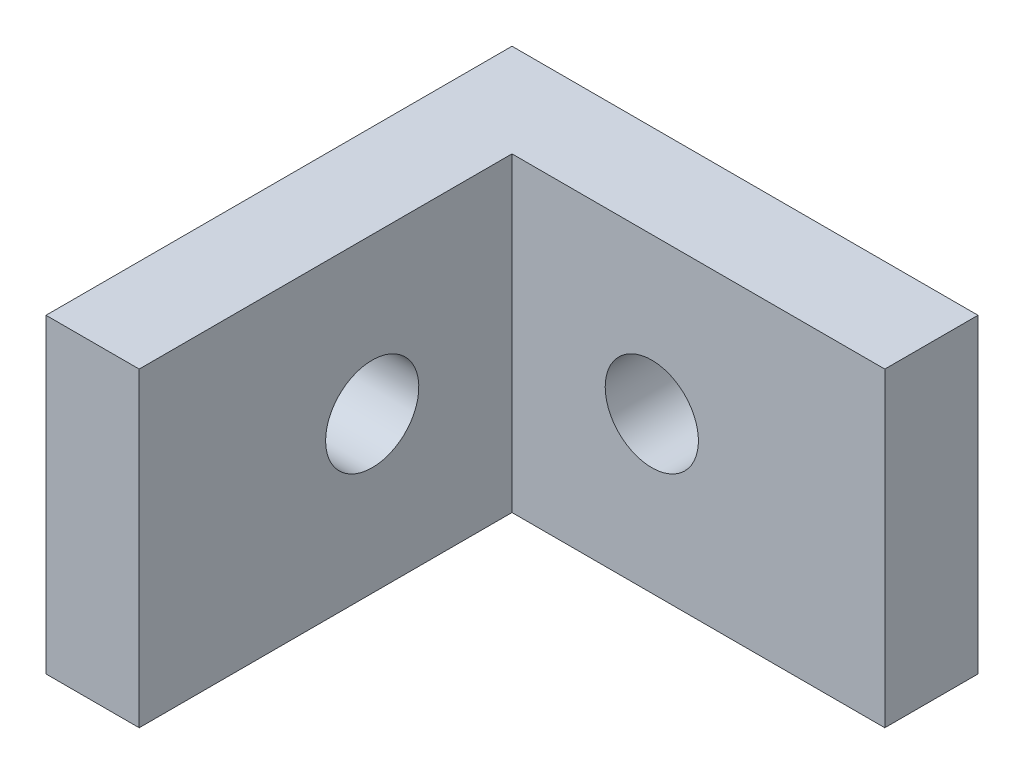
ISO-10303-21;
HEADER;
FILE_DESCRIPTION(('STEP AP214'),'2;1');
FILE_NAME('part.step','',(''),(''),'','','');
FILE_SCHEMA(('AUTOMOTIVE_DESIGN { 1 0 10303 214 1 1 1 1 }'));
ENDSEC;
DATA;
#1=APPLICATION_CONTEXT('core data for automotive mechanical design processes');
#2=APPLICATION_PROTOCOL_DEFINITION('international standard','automotive_design',2000,#1);
#3=PRODUCT_CONTEXT('',#1,'mechanical');
#4=PRODUCT('Part','Part','',(#3));
#5=PRODUCT_RELATED_PRODUCT_CATEGORY('part','',(#4));
#6=PRODUCT_DEFINITION_FORMATION('','',#4);
#7=PRODUCT_DEFINITION_CONTEXT('part definition',#1,'design');
#8=PRODUCT_DEFINITION('design','',#6,#7);
#9=PRODUCT_DEFINITION_SHAPE('','',#8);
#10=(LENGTH_UNIT() NAMED_UNIT(*) SI_UNIT(.MILLI.,.METRE.));
#11=(NAMED_UNIT(*) PLANE_ANGLE_UNIT() SI_UNIT($,.RADIAN.));
#12=(NAMED_UNIT(*) SI_UNIT($,.STERADIAN.) SOLID_ANGLE_UNIT());
#13=UNCERTAINTY_MEASURE_WITH_UNIT(LENGTH_MEASURE(1.E-05),#10,'distance_accuracy_value','');
#14=(GEOMETRIC_REPRESENTATION_CONTEXT(3) GLOBAL_UNCERTAINTY_ASSIGNED_CONTEXT((#13)) GLOBAL_UNIT_ASSIGNED_CONTEXT((#10,
#11,#12)) REPRESENTATION_CONTEXT('',''));
#15=CARTESIAN_POINT('',(0.,0.,0.));
#16=DIRECTION('',(0.,0.,1.));
#17=DIRECTION('',(1.,0.,0.));
#18=AXIS2_PLACEMENT_3D('',#15,#16,#17);
#19=CARTESIAN_POINT('',(0.,0.,3.));
#20=DIRECTION('',(0.,0.,-1.));
#21=DIRECTION('',(-1.,0.,0.));
#22=AXIS2_PLACEMENT_3D('',#19,#20,#21);
#23=PLANE('',#22);
#24=CARTESIAN_POINT('',(0.,0.,3.));
#25=DIRECTION('',(0.,0.,-1.));
#26=DIRECTION('',(-1.,0.,0.));
#27=AXIS2_PLACEMENT_3D('',#24,#25,#26);
#28=CIRCLE('',#27,1.5);
#29=CARTESIAN_POINT('',(-1.5,0.,3.));
#30=VERTEX_POINT('',#29);
#31=EDGE_CURVE('E143',#30,#30,#28,.T.);
#32=ORIENTED_EDGE('',*,*,#31,.T.);
#33=EDGE_LOOP('',(#32));
#34=FACE_BOUND('',#33,.T.);
#35=DIRECTION('',(0.,1.,0.));
#36=VECTOR('',#35,1.);
#37=CARTESIAN_POINT('',(-4.5,5.,3.));
#38=LINE('',#37,#36);
#39=CARTESIAN_POINT('',(-4.5,-5.,3.));
#40=VERTEX_POINT('',#39);
#41=CARTESIAN_POINT('',(-4.5,5.,3.));
#42=VERTEX_POINT('',#41);
#43=EDGE_CURVE('E57',#40,#42,#38,.T.);
#44=ORIENTED_EDGE('',*,*,#43,.F.);
#45=DIRECTION('',(1.,0.,0.));
#46=VECTOR('',#45,1.);
#47=CARTESIAN_POINT('',(-7.5,-5.,3.));
#48=LINE('',#47,#46);
#49=CARTESIAN_POINT('',(7.5,-5.,3.));
#50=VERTEX_POINT('',#49);
#51=EDGE_CURVE('E62',#40,#50,#48,.T.);
#52=ORIENTED_EDGE('',*,*,#51,.T.);
#53=DIRECTION('',(0.,1.,0.));
#54=VECTOR('',#53,1.);
#55=CARTESIAN_POINT('',(7.5,-5.,3.));
#56=LINE('',#55,#54);
#57=CARTESIAN_POINT('',(7.5,5.,3.));
#58=VERTEX_POINT('',#57);
#59=EDGE_CURVE('E93',#50,#58,#56,.T.);
#60=ORIENTED_EDGE('',*,*,#59,.T.);
#61=DIRECTION('',(-1.,0.,0.));
#62=VECTOR('',#61,1.);
#63=CARTESIAN_POINT('',(-7.5,5.,3.));
#64=LINE('',#63,#62);
#65=EDGE_CURVE('E145',#58,#42,#64,.T.);
#66=ORIENTED_EDGE('',*,*,#65,.T.);
#67=EDGE_LOOP('',(#44,#52,#60,#66));
#68=FACE_BOUND('',#67,.T.);
#69=ADVANCED_FACE('F41',(#34,#68),#23,.F.);
#70=CARTESIAN_POINT('',(7.5,-5.,3.));
#71=DIRECTION('',(-1.,0.,0.));
#72=DIRECTION('',(0.,-1.,0.));
#73=AXIS2_PLACEMENT_3D('',#70,#71,#72);
#74=PLANE('',#73);
#75=DIRECTION('',(0.,1.,0.));
#76=VECTOR('',#75,1.);
#77=CARTESIAN_POINT('',(7.5,-5.,0.));
#78=LINE('',#77,#76);
#79=CARTESIAN_POINT('',(7.5,-5.,0.));
#80=VERTEX_POINT('',#79);
#81=CARTESIAN_POINT('',(7.5,5.,0.));
#82=VERTEX_POINT('',#81);
#83=EDGE_CURVE('E99',#80,#82,#78,.T.);
#84=ORIENTED_EDGE('',*,*,#83,.T.);
#85=DIRECTION('',(0.,0.,-1.));
#86=VECTOR('',#85,1.);
#87=CARTESIAN_POINT('',(7.5,5.,3.));
#88=LINE('',#87,#86);
#89=EDGE_CURVE('E11',#58,#82,#88,.T.);
#90=ORIENTED_EDGE('',*,*,#89,.F.);
#91=ORIENTED_EDGE('',*,*,#59,.F.);
#92=DIRECTION('',(0.,0.,-1.));
#93=VECTOR('',#92,1.);
#94=CARTESIAN_POINT('',(7.5,-5.,3.));
#95=LINE('',#94,#93);
#96=EDGE_CURVE('E85',#50,#80,#95,.T.);
#97=ORIENTED_EDGE('',*,*,#96,.T.);
#98=EDGE_LOOP('',(#84,#90,#91,#97));
#99=FACE_BOUND('',#98,.T.);
#100=ADVANCED_FACE('F43',(#99),#74,.F.);
#101=CARTESIAN_POINT('',(-7.5,5.,3.));
#102=DIRECTION('',(0.,-1.,0.));
#103=DIRECTION('',(0.,0.,-1.));
#104=AXIS2_PLACEMENT_3D('',#101,#102,#103);
#105=PLANE('',#104);
#106=DIRECTION('',(-1.,0.,0.));
#107=VECTOR('',#106,1.);
#108=CARTESIAN_POINT('',(-7.5,5.,0.));
#109=LINE('',#108,#107);
#110=CARTESIAN_POINT('',(-7.5,5.,0.));
#111=VERTEX_POINT('',#110);
#112=EDGE_CURVE('E102',#82,#111,#109,.T.);
#113=ORIENTED_EDGE('',*,*,#112,.T.);
#114=DIRECTION('',(0.,0.,-1.));
#115=VECTOR('',#114,1.);
#116=CARTESIAN_POINT('',(-7.5,5.,3.));
#117=LINE('',#116,#115);
#118=CARTESIAN_POINT('',(-7.5,5.,15.));
#119=VERTEX_POINT('',#118);
#120=EDGE_CURVE('E50',#119,#111,#117,.T.);
#121=ORIENTED_EDGE('',*,*,#120,.F.);
#122=DIRECTION('',(-1.,0.,0.));
#123=VECTOR('',#122,1.);
#124=CARTESIAN_POINT('',(-7.5,5.,15.));
#125=LINE('',#124,#123);
#126=CARTESIAN_POINT('',(-4.5,5.,15.));
#127=VERTEX_POINT('',#126);
#128=EDGE_CURVE('E127',#127,#119,#125,.T.);
#129=ORIENTED_EDGE('',*,*,#128,.F.);
#130=DIRECTION('',(0.,0.,-1.));
#131=VECTOR('',#130,1.);
#132=CARTESIAN_POINT('',(-4.5,5.,15.));
#133=LINE('',#132,#131);
#134=EDGE_CURVE('E107',#127,#42,#133,.T.);
#135=ORIENTED_EDGE('',*,*,#134,.T.);
#136=ORIENTED_EDGE('',*,*,#65,.F.);
#137=ORIENTED_EDGE('',*,*,#89,.T.);
#138=EDGE_LOOP('',(#113,#121,#129,#135,#136,#137));
#139=FACE_BOUND('',#138,.T.);
#140=ADVANCED_FACE('F124',(#139),#105,.F.);
#141=CARTESIAN_POINT('',(-7.5,-5.,3.));
#142=DIRECTION('',(1.,0.,0.));
#143=DIRECTION('',(0.,1.,0.));
#144=AXIS2_PLACEMENT_3D('',#141,#142,#143);
#145=PLANE('',#144);
#146=CARTESIAN_POINT('',(-7.5,0.,7.5));
#147=DIRECTION('',(-1.,0.,0.));
#148=DIRECTION('',(0.,0.,1.));
#149=AXIS2_PLACEMENT_3D('',#146,#147,#148);
#150=CIRCLE('',#149,1.5);
#151=CARTESIAN_POINT('',(-7.5,0.,9.));
#152=VERTEX_POINT('',#151);
#153=EDGE_CURVE('E161',#152,#152,#150,.T.);
#154=ORIENTED_EDGE('',*,*,#153,.F.);
#155=EDGE_LOOP('',(#154));
#156=FACE_BOUND('',#155,.T.);
#157=DIRECTION('',(0.,-1.,0.));
#158=VECTOR('',#157,1.);
#159=CARTESIAN_POINT('',(-7.5,-5.,0.));
#160=LINE('',#159,#158);
#161=CARTESIAN_POINT('',(-7.5,-5.,0.));
#162=VERTEX_POINT('',#161);
#163=EDGE_CURVE('E94',#111,#162,#160,.T.);
#164=ORIENTED_EDGE('',*,*,#163,.T.);
#165=DIRECTION('',(0.,0.,-1.));
#166=VECTOR('',#165,1.);
#167=CARTESIAN_POINT('',(-7.5,-5.,3.));
#168=LINE('',#167,#166);
#169=CARTESIAN_POINT('',(-7.5,-5.,15.));
#170=VERTEX_POINT('',#169);
#171=EDGE_CURVE('E89',#170,#162,#168,.T.);
#172=ORIENTED_EDGE('',*,*,#171,.F.);
#173=DIRECTION('',(0.,-1.,0.));
#174=VECTOR('',#173,1.);
#175=CARTESIAN_POINT('',(-7.5,5.,15.));
#176=LINE('',#175,#174);
#177=EDGE_CURVE('E120',#119,#170,#176,.T.);
#178=ORIENTED_EDGE('',*,*,#177,.F.);
#179=ORIENTED_EDGE('',*,*,#120,.T.);
#180=EDGE_LOOP('',(#164,#172,#178,#179));
#181=FACE_BOUND('',#180,.T.);
#182=ADVANCED_FACE('F118',(#156,#181),#145,.F.);
#183=CARTESIAN_POINT('',(-7.5,-5.,3.));
#184=DIRECTION('',(0.,1.,0.));
#185=DIRECTION('',(0.,0.,1.));
#186=AXIS2_PLACEMENT_3D('',#183,#184,#185);
#187=PLANE('',#186);
#188=DIRECTION('',(1.,0.,0.));
#189=VECTOR('',#188,1.);
#190=CARTESIAN_POINT('',(-7.5,-5.,0.));
#191=LINE('',#190,#189);
#192=EDGE_CURVE('E82',#162,#80,#191,.T.);
#193=ORIENTED_EDGE('',*,*,#192,.T.);
#194=ORIENTED_EDGE('',*,*,#96,.F.);
#195=ORIENTED_EDGE('',*,*,#51,.F.);
#196=DIRECTION('',(0.,0.,-1.));
#197=VECTOR('',#196,1.);
#198=CARTESIAN_POINT('',(-4.5,-5.,15.));
#199=LINE('',#198,#197);
#200=CARTESIAN_POINT('',(-4.5,-5.,15.));
#201=VERTEX_POINT('',#200);
#202=EDGE_CURVE('E103',#201,#40,#199,.T.);
#203=ORIENTED_EDGE('',*,*,#202,.F.);
#204=DIRECTION('',(1.,0.,0.));
#205=VECTOR('',#204,1.);
#206=CARTESIAN_POINT('',(-7.5,-5.,15.));
#207=LINE('',#206,#205);
#208=EDGE_CURVE('E139',#170,#201,#207,.T.);
#209=ORIENTED_EDGE('',*,*,#208,.F.);
#210=ORIENTED_EDGE('',*,*,#171,.T.);
#211=EDGE_LOOP('',(#193,#194,#195,#203,#209,#210));
#212=FACE_BOUND('',#211,.T.);
#213=ADVANCED_FACE('F84',(#212),#187,.F.);
#214=CARTESIAN_POINT('',(0.,0.,0.));
#215=DIRECTION('',(0.,0.,-1.));
#216=DIRECTION('',(-1.,0.,0.));
#217=AXIS2_PLACEMENT_3D('',#214,#215,#216);
#218=PLANE('',#217);
#219=CARTESIAN_POINT('',(0.,0.,0.));
#220=DIRECTION('',(0.,0.,-1.));
#221=DIRECTION('',(-1.,0.,0.));
#222=AXIS2_PLACEMENT_3D('',#219,#220,#221);
#223=CIRCLE('',#222,1.5);
#224=CARTESIAN_POINT('',(-1.5,0.,0.));
#225=VERTEX_POINT('',#224);
#226=EDGE_CURVE('E158',#225,#225,#223,.T.);
#227=ORIENTED_EDGE('',*,*,#226,.F.);
#228=EDGE_LOOP('',(#227));
#229=FACE_BOUND('',#228,.T.);
#230=ORIENTED_EDGE('',*,*,#83,.F.);
#231=ORIENTED_EDGE('',*,*,#192,.F.);
#232=ORIENTED_EDGE('',*,*,#163,.F.);
#233=ORIENTED_EDGE('',*,*,#112,.F.);
#234=EDGE_LOOP('',(#230,#231,#232,#233));
#235=FACE_BOUND('',#234,.T.);
#236=ADVANCED_FACE('F101',(#229,#235),#218,.T.);
#237=CARTESIAN_POINT('',(-4.5,5.,15.));
#238=DIRECTION('',(-1.,0.,0.));
#239=DIRECTION('',(0.,-1.,0.));
#240=AXIS2_PLACEMENT_3D('',#237,#238,#239);
#241=PLANE('',#240);
#242=CARTESIAN_POINT('',(-4.5,0.,7.5));
#243=DIRECTION('',(-1.,0.,0.));
#244=DIRECTION('',(0.,-1.,0.));
#245=AXIS2_PLACEMENT_3D('',#242,#243,#244);
#246=CIRCLE('',#245,1.5);
#247=CARTESIAN_POINT('',(-4.5,-1.5,7.5));
#248=VERTEX_POINT('',#247);
#249=EDGE_CURVE('E45',#248,#248,#246,.T.);
#250=ORIENTED_EDGE('',*,*,#249,.T.);
#251=EDGE_LOOP('',(#250));
#252=FACE_BOUND('',#251,.T.);
#253=ORIENTED_EDGE('',*,*,#43,.T.);
#254=ORIENTED_EDGE('',*,*,#134,.F.);
#255=DIRECTION('',(0.,1.,0.));
#256=VECTOR('',#255,1.);
#257=CARTESIAN_POINT('',(-4.5,5.,15.));
#258=LINE('',#257,#256);
#259=EDGE_CURVE('E135',#201,#127,#258,.T.);
#260=ORIENTED_EDGE('',*,*,#259,.F.);
#261=ORIENTED_EDGE('',*,*,#202,.T.);
#262=EDGE_LOOP('',(#253,#254,#260,#261));
#263=FACE_BOUND('',#262,.T.);
#264=ADVANCED_FACE('F148',(#252,#263),#241,.F.);
#265=CARTESIAN_POINT('',(0.,0.,15.));
#266=DIRECTION('',(0.,0.,1.));
#267=DIRECTION('',(1.,0.,0.));
#268=AXIS2_PLACEMENT_3D('',#265,#266,#267);
#269=PLANE('',#268);
#270=ORIENTED_EDGE('',*,*,#177,.T.);
#271=ORIENTED_EDGE('',*,*,#208,.T.);
#272=ORIENTED_EDGE('',*,*,#259,.T.);
#273=ORIENTED_EDGE('',*,*,#128,.T.);
#274=EDGE_LOOP('',(#270,#271,#272,#273));
#275=FACE_BOUND('',#274,.T.);
#276=ADVANCED_FACE('F131',(#275),#269,.T.);
#277=CARTESIAN_POINT('',(0.,0.,7.));
#278=DIRECTION('',(0.,0.,-1.));
#279=DIRECTION('',(-1.,0.,0.));
#280=AXIS2_PLACEMENT_3D('',#277,#278,#279);
#281=CYLINDRICAL_SURFACE('',#280,1.5);
#282=ORIENTED_EDGE('',*,*,#226,.T.);
#283=EDGE_LOOP('',(#282));
#284=FACE_BOUND('',#283,.T.);
#285=ORIENTED_EDGE('',*,*,#31,.F.);
#286=EDGE_LOOP('',(#285));
#287=FACE_BOUND('',#286,.T.);
#288=ADVANCED_FACE('F171',(#284,#287),#281,.F.);
#289=CARTESIAN_POINT('',(-0.499999999999999,0.,7.5));
#290=DIRECTION('',(-1.,0.,0.));
#291=DIRECTION('',(0.,0.,1.));
#292=AXIS2_PLACEMENT_3D('',#289,#290,#291);
#293=CYLINDRICAL_SURFACE('',#292,1.5);
#294=ORIENTED_EDGE('',*,*,#153,.T.);
#295=EDGE_LOOP('',(#294));
#296=FACE_BOUND('',#295,.T.);
#297=ORIENTED_EDGE('',*,*,#249,.F.);
#298=EDGE_LOOP('',(#297));
#299=FACE_BOUND('',#298,.T.);
#300=ADVANCED_FACE('F169',(#296,#299),#293,.F.);
#301=CLOSED_SHELL('',(#69,#100,#140,#182,#213,#236,#264,#276,#288,#300));
#302=MANIFOLD_SOLID_BREP('B2',#301);
#303=ADVANCED_BREP_SHAPE_REPRESENTATION('',(#18,#302),#14);
#304=SHAPE_DEFINITION_REPRESENTATION(#9,#303);
ENDSEC;
END-ISO-10303-21;
